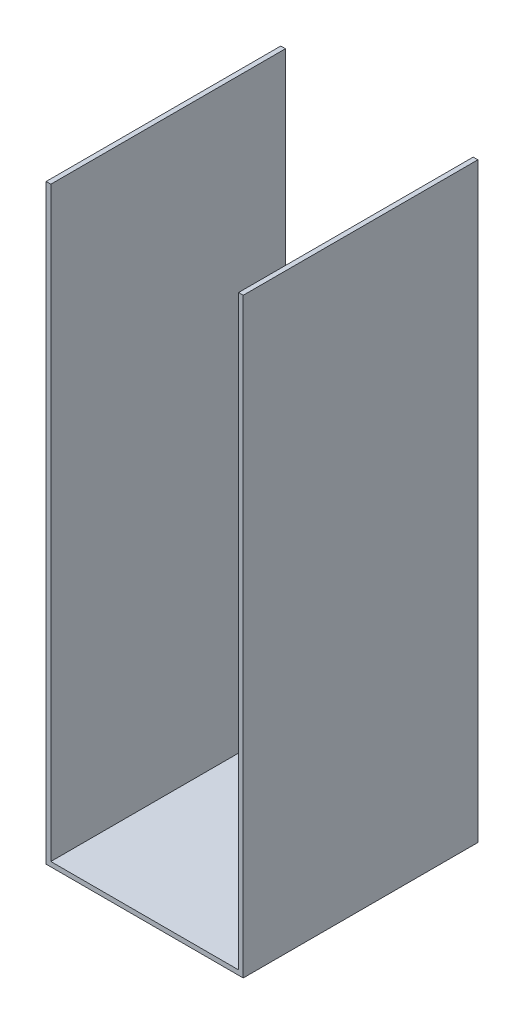
ISO-10303-21;
HEADER;
FILE_DESCRIPTION(('STEP AP214'),'2;1');
FILE_NAME('part.step','',(''),(''),'','','');
FILE_SCHEMA(('AUTOMOTIVE_DESIGN { 1 0 10303 214 1 1 1 1 }'));
ENDSEC;
DATA;
#1=APPLICATION_CONTEXT('core data for automotive mechanical design processes');
#2=APPLICATION_PROTOCOL_DEFINITION('international standard','automotive_design',2000,#1);
#3=PRODUCT_CONTEXT('',#1,'mechanical');
#4=PRODUCT('Part','Part','',(#3));
#5=PRODUCT_RELATED_PRODUCT_CATEGORY('part','',(#4));
#6=PRODUCT_DEFINITION_FORMATION('','',#4);
#7=PRODUCT_DEFINITION_CONTEXT('part definition',#1,'design');
#8=PRODUCT_DEFINITION('design','',#6,#7);
#9=PRODUCT_DEFINITION_SHAPE('','',#8);
#10=(LENGTH_UNIT() NAMED_UNIT(*) SI_UNIT(.MILLI.,.METRE.));
#11=(NAMED_UNIT(*) PLANE_ANGLE_UNIT() SI_UNIT($,.RADIAN.));
#12=(NAMED_UNIT(*) SI_UNIT($,.STERADIAN.) SOLID_ANGLE_UNIT());
#13=UNCERTAINTY_MEASURE_WITH_UNIT(LENGTH_MEASURE(1.E-05),#10,'distance_accuracy_value','');
#14=(GEOMETRIC_REPRESENTATION_CONTEXT(3) GLOBAL_UNCERTAINTY_ASSIGNED_CONTEXT((#13)) GLOBAL_UNIT_ASSIGNED_CONTEXT((#10,
#11,#12)) REPRESENTATION_CONTEXT('',''));
#15=CARTESIAN_POINT('',(0.,0.,0.));
#16=DIRECTION('',(0.,0.,1.));
#17=DIRECTION('',(1.,0.,0.));
#18=AXIS2_PLACEMENT_3D('',#15,#16,#17);
#19=CARTESIAN_POINT('',(-200.,0.,-10000.));
#20=DIRECTION('',(0.,1.,0.));
#21=DIRECTION('',(0.,0.,1.));
#22=AXIS2_PLACEMENT_3D('',#19,#20,#21);
#23=PLANE('',#22);
#24=DIRECTION('',(-1.,0.,0.));
#25=VECTOR('',#24,1.);
#26=CARTESIAN_POINT('',(-200.,0.,0.));
#27=LINE('',#26,#25);
#28=CARTESIAN_POINT('',(0.,0.,0.));
#29=VERTEX_POINT('',#28);
#30=CARTESIAN_POINT('',(-200.,0.,0.));
#31=VERTEX_POINT('',#30);
#32=EDGE_CURVE('E146',#29,#31,#27,.T.);
#33=ORIENTED_EDGE('',*,*,#32,.F.);
#34=DIRECTION('',(0.,0.,1.));
#35=VECTOR('',#34,1.);
#36=CARTESIAN_POINT('',(0.,0.,-10000.));
#37=LINE('',#36,#35);
#38=CARTESIAN_POINT('',(0.,0.,-10000.));
#39=VERTEX_POINT('',#38);
#40=EDGE_CURVE('E11',#39,#29,#37,.T.);
#41=ORIENTED_EDGE('',*,*,#40,.F.);
#42=DIRECTION('',(-1.,0.,0.));
#43=VECTOR('',#42,1.);
#44=CARTESIAN_POINT('',(-200.,0.,-10000.));
#45=LINE('',#44,#43);
#46=CARTESIAN_POINT('',(-200.,0.,-10000.));
#47=VERTEX_POINT('',#46);
#48=EDGE_CURVE('E174',#39,#47,#45,.T.);
#49=ORIENTED_EDGE('',*,*,#48,.T.);
#50=DIRECTION('',(0.,0.,1.));
#51=VECTOR('',#50,1.);
#52=CARTESIAN_POINT('',(-200.,0.,-10000.));
#53=LINE('',#52,#51);
#54=EDGE_CURVE('E46',#47,#31,#53,.T.);
#55=ORIENTED_EDGE('',*,*,#54,.T.);
#56=EDGE_LOOP('',(#33,#41,#49,#55));
#57=FACE_BOUND('',#56,.T.);
#58=ADVANCED_FACE('F43',(#57),#23,.T.);
#59=CARTESIAN_POINT('',(0.,0.,-10000.));
#60=DIRECTION('',(1.,0.,0.));
#61=DIRECTION('',(0.,1.,0.));
#62=AXIS2_PLACEMENT_3D('',#59,#60,#61);
#63=PLANE('',#62);
#64=DIRECTION('',(0.,1.,0.));
#65=VECTOR('',#64,1.);
#66=CARTESIAN_POINT('',(0.,0.,0.));
#67=LINE('',#66,#65);
#68=CARTESIAN_POINT('',(3.06161699786838E-12,-25000.,0.));
#69=VERTEX_POINT('',#68);
#70=EDGE_CURVE('E171',#69,#29,#67,.T.);
#71=ORIENTED_EDGE('',*,*,#70,.F.);
#72=DIRECTION('',(0.,0.,1.));
#73=VECTOR('',#72,1.);
#74=CARTESIAN_POINT('',(3.06161699786838E-12,-25000.,-10000.));
#75=LINE('',#74,#73);
#76=CARTESIAN_POINT('',(3.06161699786838E-12,-25000.,-10000.));
#77=VERTEX_POINT('',#76);
#78=EDGE_CURVE('E53',#77,#69,#75,.T.);
#79=ORIENTED_EDGE('',*,*,#78,.F.);
#80=DIRECTION('',(0.,1.,0.));
#81=VECTOR('',#80,1.);
#82=CARTESIAN_POINT('',(0.,0.,-10000.));
#83=LINE('',#82,#81);
#84=EDGE_CURVE('E132',#77,#39,#83,.T.);
#85=ORIENTED_EDGE('',*,*,#84,.T.);
#86=ORIENTED_EDGE('',*,*,#40,.T.);
#87=EDGE_LOOP('',(#71,#79,#85,#86));
#88=FACE_BOUND('',#87,.T.);
#89=ADVANCED_FACE('F192',(#88),#63,.T.);
#90=CARTESIAN_POINT('',(3.06161699786838E-12,-25000.,-10000.));
#91=DIRECTION('',(0.,1.,0.));
#92=DIRECTION('',(0.,0.,1.));
#93=AXIS2_PLACEMENT_3D('',#90,#91,#92);
#94=PLANE('',#93);
#95=DIRECTION('',(-1.,0.,0.));
#96=VECTOR('',#95,1.);
#97=CARTESIAN_POINT('',(3.06161699786838E-12,-25000.,0.));
#98=LINE('',#97,#96);
#99=CARTESIAN_POINT('',(8000.,-25000.,0.));
#100=VERTEX_POINT('',#99);
#101=EDGE_CURVE('E118',#100,#69,#98,.T.);
#102=ORIENTED_EDGE('',*,*,#101,.F.);
#103=DIRECTION('',(0.,0.,1.));
#104=VECTOR('',#103,1.);
#105=CARTESIAN_POINT('',(8000.,-25000.,-10000.));
#106=LINE('',#105,#104);
#107=CARTESIAN_POINT('',(8000.,-25000.,-10000.));
#108=VERTEX_POINT('',#107);
#109=EDGE_CURVE('E113',#108,#100,#106,.T.);
#110=ORIENTED_EDGE('',*,*,#109,.F.);
#111=DIRECTION('',(-1.,0.,0.));
#112=VECTOR('',#111,1.);
#113=CARTESIAN_POINT('',(3.06161699786838E-12,-25000.,-10000.));
#114=LINE('',#113,#112);
#115=EDGE_CURVE('E116',#108,#77,#114,.T.);
#116=ORIENTED_EDGE('',*,*,#115,.T.);
#117=ORIENTED_EDGE('',*,*,#78,.T.);
#118=EDGE_LOOP('',(#102,#110,#116,#117));
#119=FACE_BOUND('',#118,.T.);
#120=ADVANCED_FACE('F115',(#119),#94,.T.);
#121=CARTESIAN_POINT('',(8000.,-25000.,-10000.));
#122=DIRECTION('',(-1.,0.,0.));
#123=DIRECTION('',(0.,0.,1.));
#124=AXIS2_PLACEMENT_3D('',#121,#122,#123);
#125=PLANE('',#124);
#126=DIRECTION('',(0.,-1.,0.));
#127=VECTOR('',#126,1.);
#128=CARTESIAN_POINT('',(8000.,-25000.,0.));
#129=LINE('',#128,#127);
#130=CARTESIAN_POINT('',(8000.,0.,0.));
#131=VERTEX_POINT('',#130);
#132=EDGE_CURVE('E166',#131,#100,#129,.T.);
#133=ORIENTED_EDGE('',*,*,#132,.F.);
#134=DIRECTION('',(0.,0.,1.));
#135=VECTOR('',#134,1.);
#136=CARTESIAN_POINT('',(8000.,0.,-10000.));
#137=LINE('',#136,#135);
#138=CARTESIAN_POINT('',(8000.,0.,-10000.));
#139=VERTEX_POINT('',#138);
#140=EDGE_CURVE('E124',#139,#131,#137,.T.);
#141=ORIENTED_EDGE('',*,*,#140,.F.);
#142=DIRECTION('',(0.,-1.,0.));
#143=VECTOR('',#142,1.);
#144=CARTESIAN_POINT('',(8000.,-25000.,-10000.));
#145=LINE('',#144,#143);
#146=EDGE_CURVE('E130',#139,#108,#145,.T.);
#147=ORIENTED_EDGE('',*,*,#146,.T.);
#148=ORIENTED_EDGE('',*,*,#109,.T.);
#149=EDGE_LOOP('',(#133,#141,#147,#148));
#150=FACE_BOUND('',#149,.T.);
#151=ADVANCED_FACE('F135',(#150),#125,.T.);
#152=CARTESIAN_POINT('',(8000.,0.,-10000.));
#153=DIRECTION('',(0.,1.,0.));
#154=DIRECTION('',(0.,0.,1.));
#155=AXIS2_PLACEMENT_3D('',#152,#153,#154);
#156=PLANE('',#155);
#157=DIRECTION('',(-1.,0.,0.));
#158=VECTOR('',#157,1.);
#159=CARTESIAN_POINT('',(8000.,0.,0.));
#160=LINE('',#159,#158);
#161=CARTESIAN_POINT('',(8200.,0.,0.));
#162=VERTEX_POINT('',#161);
#163=EDGE_CURVE('E162',#162,#131,#160,.T.);
#164=ORIENTED_EDGE('',*,*,#163,.F.);
#165=DIRECTION('',(0.,0.,1.));
#166=VECTOR('',#165,1.);
#167=CARTESIAN_POINT('',(8200.,0.,-10000.));
#168=LINE('',#167,#166);
#169=CARTESIAN_POINT('',(8200.,0.,-10000.));
#170=VERTEX_POINT('',#169);
#171=EDGE_CURVE('E180',#170,#162,#168,.T.);
#172=ORIENTED_EDGE('',*,*,#171,.F.);
#173=DIRECTION('',(-1.,0.,0.));
#174=VECTOR('',#173,1.);
#175=CARTESIAN_POINT('',(8000.,0.,-10000.));
#176=LINE('',#175,#174);
#177=EDGE_CURVE('E137',#170,#139,#176,.T.);
#178=ORIENTED_EDGE('',*,*,#177,.T.);
#179=ORIENTED_EDGE('',*,*,#140,.T.);
#180=EDGE_LOOP('',(#164,#172,#178,#179));
#181=FACE_BOUND('',#180,.T.);
#182=ADVANCED_FACE('F205',(#181),#156,.T.);
#183=CARTESIAN_POINT('',(8200.,-25200.,-10000.));
#184=DIRECTION('',(1.,0.,0.));
#185=DIRECTION('',(0.,0.,-1.));
#186=AXIS2_PLACEMENT_3D('',#183,#184,#185);
#187=PLANE('',#186);
#188=DIRECTION('',(0.,1.,0.));
#189=VECTOR('',#188,1.);
#190=CARTESIAN_POINT('',(8200.,-25200.,0.));
#191=LINE('',#190,#189);
#192=CARTESIAN_POINT('',(8200.,-25200.,0.));
#193=VERTEX_POINT('',#192);
#194=EDGE_CURVE('E158',#193,#162,#191,.T.);
#195=ORIENTED_EDGE('',*,*,#194,.F.);
#196=DIRECTION('',(0.,0.,1.));
#197=VECTOR('',#196,1.);
#198=CARTESIAN_POINT('',(8200.,-25200.,-10000.));
#199=LINE('',#198,#197);
#200=CARTESIAN_POINT('',(8200.,-25200.,-10000.));
#201=VERTEX_POINT('',#200);
#202=EDGE_CURVE('E183',#201,#193,#199,.T.);
#203=ORIENTED_EDGE('',*,*,#202,.F.);
#204=DIRECTION('',(0.,1.,0.));
#205=VECTOR('',#204,1.);
#206=CARTESIAN_POINT('',(8200.,-25200.,-10000.));
#207=LINE('',#206,#205);
#208=EDGE_CURVE('E140',#201,#170,#207,.T.);
#209=ORIENTED_EDGE('',*,*,#208,.T.);
#210=ORIENTED_EDGE('',*,*,#171,.T.);
#211=EDGE_LOOP('',(#195,#203,#209,#210));
#212=FACE_BOUND('',#211,.T.);
#213=ADVANCED_FACE('F208',(#212),#187,.T.);
#214=CARTESIAN_POINT('',(-199.999999999996,-25200.,-10000.));
#215=DIRECTION('',(0.,-1.,0.));
#216=DIRECTION('',(0.,0.,-1.));
#217=AXIS2_PLACEMENT_3D('',#214,#215,#216);
#218=PLANE('',#217);
#219=DIRECTION('',(1.,0.,0.));
#220=VECTOR('',#219,1.);
#221=CARTESIAN_POINT('',(-199.999999999996,-25200.,0.));
#222=LINE('',#221,#220);
#223=CARTESIAN_POINT('',(-199.999999999996,-25200.,0.));
#224=VERTEX_POINT('',#223);
#225=EDGE_CURVE('E154',#224,#193,#222,.T.);
#226=ORIENTED_EDGE('',*,*,#225,.F.);
#227=DIRECTION('',(0.,0.,1.));
#228=VECTOR('',#227,1.);
#229=CARTESIAN_POINT('',(-199.999999999996,-25200.,-10000.));
#230=LINE('',#229,#228);
#231=CARTESIAN_POINT('',(-199.999999999996,-25200.,-10000.));
#232=VERTEX_POINT('',#231);
#233=EDGE_CURVE('E185',#232,#224,#230,.T.);
#234=ORIENTED_EDGE('',*,*,#233,.F.);
#235=DIRECTION('',(1.,0.,0.));
#236=VECTOR('',#235,1.);
#237=CARTESIAN_POINT('',(-199.999999999996,-25200.,-10000.));
#238=LINE('',#237,#236);
#239=EDGE_CURVE('E303',#232,#201,#238,.T.);
#240=ORIENTED_EDGE('',*,*,#239,.T.);
#241=ORIENTED_EDGE('',*,*,#202,.T.);
#242=EDGE_LOOP('',(#226,#234,#240,#241));
#243=FACE_BOUND('',#242,.T.);
#244=ADVANCED_FACE('F212',(#243),#218,.T.);
#245=CARTESIAN_POINT('',(-200.,0.,-10000.));
#246=DIRECTION('',(-1.,0.,0.));
#247=DIRECTION('',(0.,-1.,0.));
#248=AXIS2_PLACEMENT_3D('',#245,#246,#247);
#249=PLANE('',#248);
#250=DIRECTION('',(0.,-1.,0.));
#251=VECTOR('',#250,1.);
#252=CARTESIAN_POINT('',(-200.,0.,0.));
#253=LINE('',#252,#251);
#254=EDGE_CURVE('E150',#31,#224,#253,.T.);
#255=ORIENTED_EDGE('',*,*,#254,.F.);
#256=ORIENTED_EDGE('',*,*,#54,.F.);
#257=DIRECTION('',(0.,-1.,0.));
#258=VECTOR('',#257,1.);
#259=CARTESIAN_POINT('',(-200.,0.,-10000.));
#260=LINE('',#259,#258);
#261=EDGE_CURVE('E306',#47,#232,#260,.T.);
#262=ORIENTED_EDGE('',*,*,#261,.T.);
#263=ORIENTED_EDGE('',*,*,#233,.T.);
#264=EDGE_LOOP('',(#255,#256,#262,#263));
#265=FACE_BOUND('',#264,.T.);
#266=ADVANCED_FACE('F189',(#265),#249,.T.);
#267=CARTESIAN_POINT('',(0.,0.,-10000.));
#268=DIRECTION('',(0.,0.,-1.));
#269=DIRECTION('',(-1.,0.,0.));
#270=AXIS2_PLACEMENT_3D('',#267,#268,#269);
#271=PLANE('',#270);
#272=ORIENTED_EDGE('',*,*,#48,.F.);
#273=ORIENTED_EDGE('',*,*,#84,.F.);
#274=ORIENTED_EDGE('',*,*,#115,.F.);
#275=ORIENTED_EDGE('',*,*,#146,.F.);
#276=ORIENTED_EDGE('',*,*,#177,.F.);
#277=ORIENTED_EDGE('',*,*,#208,.F.);
#278=ORIENTED_EDGE('',*,*,#239,.F.);
#279=ORIENTED_EDGE('',*,*,#261,.F.);
#280=EDGE_LOOP('',(#272,#273,#274,#275,#276,#277,#278,#279));
#281=FACE_BOUND('',#280,.T.);
#282=ADVANCED_FACE('F128',(#281),#271,.T.);
#283=CARTESIAN_POINT('',(0.,0.,0.));
#284=DIRECTION('',(0.,0.,-1.));
#285=DIRECTION('',(-1.,0.,0.));
#286=AXIS2_PLACEMENT_3D('',#283,#284,#285);
#287=PLANE('',#286);
#288=ORIENTED_EDGE('',*,*,#32,.T.);
#289=ORIENTED_EDGE('',*,*,#254,.T.);
#290=ORIENTED_EDGE('',*,*,#225,.T.);
#291=ORIENTED_EDGE('',*,*,#194,.T.);
#292=ORIENTED_EDGE('',*,*,#163,.T.);
#293=ORIENTED_EDGE('',*,*,#132,.T.);
#294=ORIENTED_EDGE('',*,*,#101,.T.);
#295=ORIENTED_EDGE('',*,*,#70,.T.);
#296=EDGE_LOOP('',(#288,#289,#290,#291,#292,#293,#294,#295));
#297=FACE_BOUND('',#296,.T.);
#298=ADVANCED_FACE('F191',(#297),#287,.F.);
#299=CLOSED_SHELL('',(#58,#89,#120,#151,#182,#213,#244,#266,#282,#298));
#300=MANIFOLD_SOLID_BREP('B2',#299);
#301=ADVANCED_BREP_SHAPE_REPRESENTATION('',(#18,#300),#14);
#302=SHAPE_DEFINITION_REPRESENTATION(#9,#301);
ENDSEC;
END-ISO-10303-21;
